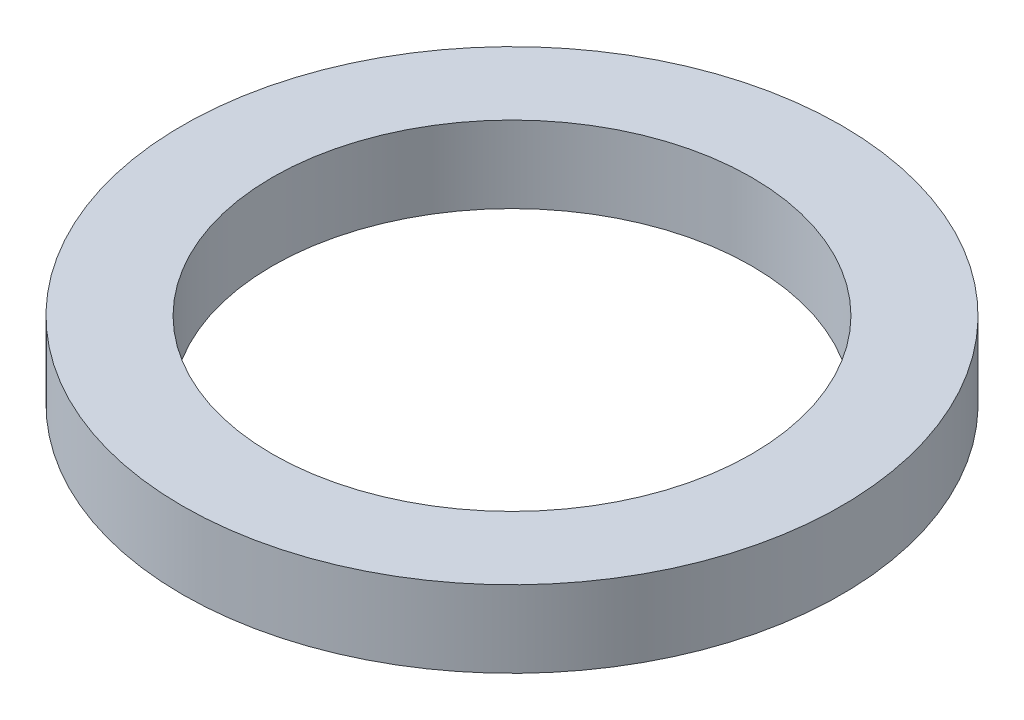
ISO-10303-21;
HEADER;
FILE_DESCRIPTION(('STEP AP214'),'2;1');
FILE_NAME('part.step','',(''),(''),'','','');
FILE_SCHEMA(('AUTOMOTIVE_DESIGN { 1 0 10303 214 1 1 1 1 }'));
ENDSEC;
DATA;
#1=APPLICATION_CONTEXT('core data for automotive mechanical design processes');
#2=APPLICATION_PROTOCOL_DEFINITION('international standard','automotive_design',2000,#1);
#3=PRODUCT_CONTEXT('',#1,'mechanical');
#4=PRODUCT('Part','Part','',(#3));
#5=PRODUCT_RELATED_PRODUCT_CATEGORY('part','',(#4));
#6=PRODUCT_DEFINITION_FORMATION('','',#4);
#7=PRODUCT_DEFINITION_CONTEXT('part definition',#1,'design');
#8=PRODUCT_DEFINITION('design','',#6,#7);
#9=PRODUCT_DEFINITION_SHAPE('','',#8);
#10=(LENGTH_UNIT() NAMED_UNIT(*) SI_UNIT(.MILLI.,.METRE.));
#11=(NAMED_UNIT(*) PLANE_ANGLE_UNIT() SI_UNIT($,.RADIAN.));
#12=(NAMED_UNIT(*) SI_UNIT($,.STERADIAN.) SOLID_ANGLE_UNIT());
#13=UNCERTAINTY_MEASURE_WITH_UNIT(LENGTH_MEASURE(1.E-05),#10,'distance_accuracy_value','');
#14=(GEOMETRIC_REPRESENTATION_CONTEXT(3) GLOBAL_UNCERTAINTY_ASSIGNED_CONTEXT((#13)) GLOBAL_UNIT_ASSIGNED_CONTEXT((#10,
#11,#12)) REPRESENTATION_CONTEXT('',''));
#15=CARTESIAN_POINT('',(0.,0.,0.));
#16=DIRECTION('',(0.,0.,1.));
#17=DIRECTION('',(1.,0.,0.));
#18=AXIS2_PLACEMENT_3D('',#15,#16,#17);
#19=CARTESIAN_POINT('',(0.,3.2,0.));
#20=DIRECTION('',(0.,1.,0.));
#21=DIRECTION('',(0.,0.,1.));
#22=AXIS2_PLACEMENT_3D('',#19,#20,#21);
#23=PLANE('',#22);
#24=CARTESIAN_POINT('',(0.,3.2,0.));
#25=DIRECTION('',(0.,1.,0.));
#26=DIRECTION('',(0.,0.,1.));
#27=AXIS2_PLACEMENT_3D('',#24,#25,#26);
#28=CIRCLE('',#27,13.75);
#29=CARTESIAN_POINT('',(0.,3.2,13.75));
#30=VERTEX_POINT('',#29);
#31=EDGE_CURVE('E10',#30,#30,#28,.T.);
#32=ORIENTED_EDGE('',*,*,#31,.T.);
#33=EDGE_LOOP('',(#32));
#34=FACE_BOUND('',#33,.T.);
#35=CARTESIAN_POINT('',(0.,3.2,0.));
#36=DIRECTION('',(0.,1.,0.));
#37=DIRECTION('',(0.,0.,1.));
#38=AXIS2_PLACEMENT_3D('',#35,#36,#37);
#39=CIRCLE('',#38,10.);
#40=CARTESIAN_POINT('',(0.,3.2,10.));
#41=VERTEX_POINT('',#40);
#42=EDGE_CURVE('E44',#41,#41,#39,.T.);
#43=ORIENTED_EDGE('',*,*,#42,.F.);
#44=EDGE_LOOP('',(#43));
#45=FACE_BOUND('',#44,.T.);
#46=ADVANCED_FACE('F33',(#34,#45),#23,.T.);
#47=CARTESIAN_POINT('',(0.,0.,0.));
#48=DIRECTION('',(0.,1.,0.));
#49=DIRECTION('',(0.,0.,1.));
#50=AXIS2_PLACEMENT_3D('',#47,#48,#49);
#51=PLANE('',#50);
#52=CARTESIAN_POINT('',(0.,0.,0.));
#53=DIRECTION('',(0.,1.,0.));
#54=DIRECTION('',(0.,0.,1.));
#55=AXIS2_PLACEMENT_3D('',#52,#53,#54);
#56=CIRCLE('',#55,13.75);
#57=CARTESIAN_POINT('',(0.,0.,13.75));
#58=VERTEX_POINT('',#57);
#59=EDGE_CURVE('E37',#58,#58,#56,.T.);
#60=ORIENTED_EDGE('',*,*,#59,.F.);
#61=EDGE_LOOP('',(#60));
#62=FACE_BOUND('',#61,.T.);
#63=CARTESIAN_POINT('',(0.,0.,0.));
#64=DIRECTION('',(0.,1.,0.));
#65=DIRECTION('',(0.,0.,1.));
#66=AXIS2_PLACEMENT_3D('',#63,#64,#65);
#67=CIRCLE('',#66,10.);
#68=CARTESIAN_POINT('',(0.,0.,10.));
#69=VERTEX_POINT('',#68);
#70=EDGE_CURVE('E46',#69,#69,#67,.T.);
#71=ORIENTED_EDGE('',*,*,#70,.T.);
#72=EDGE_LOOP('',(#71));
#73=FACE_BOUND('',#72,.T.);
#74=ADVANCED_FACE('F56',(#62,#73),#51,.F.);
#75=CARTESIAN_POINT('',(0.,3.2,0.));
#76=DIRECTION('',(0.,-1.,0.));
#77=DIRECTION('',(0.,0.,-1.));
#78=AXIS2_PLACEMENT_3D('',#75,#76,#77);
#79=CYLINDRICAL_SURFACE('',#78,13.75);
#80=ORIENTED_EDGE('',*,*,#31,.F.);
#81=EDGE_LOOP('',(#80));
#82=FACE_BOUND('',#81,.T.);
#83=ORIENTED_EDGE('',*,*,#59,.T.);
#84=EDGE_LOOP('',(#83));
#85=FACE_BOUND('',#84,.T.);
#86=ADVANCED_FACE('F35',(#82,#85),#79,.T.);
#87=CARTESIAN_POINT('',(0.,3.2,0.));
#88=DIRECTION('',(0.,-1.,0.));
#89=DIRECTION('',(0.,0.,-1.));
#90=AXIS2_PLACEMENT_3D('',#87,#88,#89);
#91=CYLINDRICAL_SURFACE('',#90,10.);
#92=ORIENTED_EDGE('',*,*,#42,.T.);
#93=EDGE_LOOP('',(#92));
#94=FACE_BOUND('',#93,.T.);
#95=ORIENTED_EDGE('',*,*,#70,.F.);
#96=EDGE_LOOP('',(#95));
#97=FACE_BOUND('',#96,.T.);
#98=ADVANCED_FACE('F52',(#94,#97),#91,.F.);
#99=CLOSED_SHELL('',(#46,#74,#86,#98));
#100=MANIFOLD_SOLID_BREP('B2',#99);
#101=ADVANCED_BREP_SHAPE_REPRESENTATION('',(#18,#100),#14);
#102=SHAPE_DEFINITION_REPRESENTATION(#9,#101);
ENDSEC;
END-ISO-10303-21;
